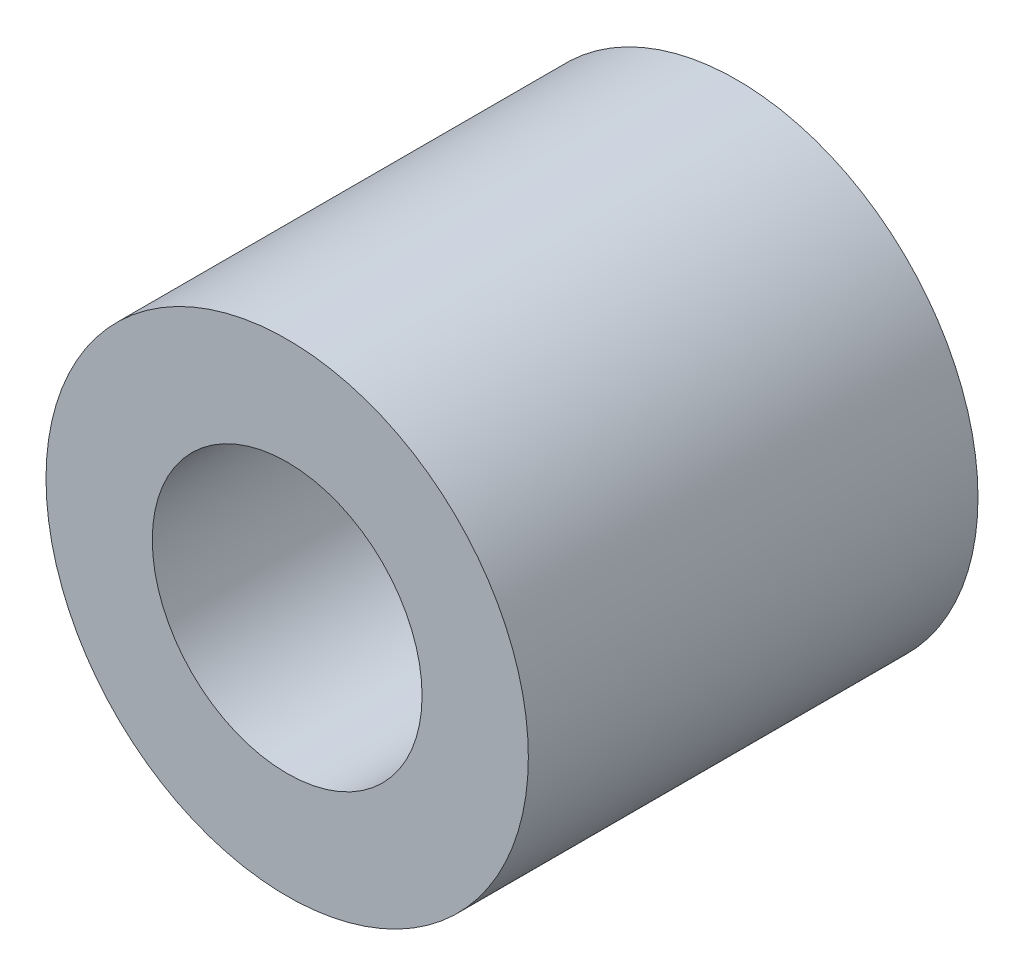
ISO-10303-21;
HEADER;
FILE_DESCRIPTION(('STEP AP214'),'2;1');
FILE_NAME('part.step','',(''),(''),'','','');
FILE_SCHEMA(('AUTOMOTIVE_DESIGN { 1 0 10303 214 1 1 1 1 }'));
ENDSEC;
DATA;
#1=APPLICATION_CONTEXT('core data for automotive mechanical design processes');
#2=APPLICATION_PROTOCOL_DEFINITION('international standard','automotive_design',2000,#1);
#3=PRODUCT_CONTEXT('',#1,'mechanical');
#4=PRODUCT('Part','Part','',(#3));
#5=PRODUCT_RELATED_PRODUCT_CATEGORY('part','',(#4));
#6=PRODUCT_DEFINITION_FORMATION('','',#4);
#7=PRODUCT_DEFINITION_CONTEXT('part definition',#1,'design');
#8=PRODUCT_DEFINITION('design','',#6,#7);
#9=PRODUCT_DEFINITION_SHAPE('','',#8);
#10=(LENGTH_UNIT() NAMED_UNIT(*) SI_UNIT(.MILLI.,.METRE.));
#11=(NAMED_UNIT(*) PLANE_ANGLE_UNIT() SI_UNIT($,.RADIAN.));
#12=(NAMED_UNIT(*) SI_UNIT($,.STERADIAN.) SOLID_ANGLE_UNIT());
#13=UNCERTAINTY_MEASURE_WITH_UNIT(LENGTH_MEASURE(1.E-05),#10,'distance_accuracy_value','');
#14=(GEOMETRIC_REPRESENTATION_CONTEXT(3) GLOBAL_UNCERTAINTY_ASSIGNED_CONTEXT((#13)) GLOBAL_UNIT_ASSIGNED_CONTEXT((#10,
#11,#12)) REPRESENTATION_CONTEXT('',''));
#15=CARTESIAN_POINT('',(0.,0.,0.));
#16=DIRECTION('',(0.,0.,1.));
#17=DIRECTION('',(1.,0.,0.));
#18=AXIS2_PLACEMENT_3D('',#15,#16,#17);
#19=CARTESIAN_POINT('',(0.,0.,5.5));
#20=DIRECTION('',(0.,0.,1.));
#21=DIRECTION('',(1.,0.,0.));
#22=AXIS2_PLACEMENT_3D('',#19,#20,#21);
#23=PLANE('',#22);
#24=CARTESIAN_POINT('',(0.,0.,5.5));
#25=DIRECTION('',(0.,0.,1.));
#26=DIRECTION('',(1.,0.,0.));
#27=AXIS2_PLACEMENT_3D('',#24,#25,#26);
#28=CIRCLE('',#27,2.95);
#29=CARTESIAN_POINT('',(2.95,0.,5.5));
#30=VERTEX_POINT('',#29);
#31=EDGE_CURVE('E10',#30,#30,#28,.T.);
#32=ORIENTED_EDGE('',*,*,#31,.T.);
#33=EDGE_LOOP('',(#32));
#34=FACE_BOUND('',#33,.T.);
#35=CARTESIAN_POINT('',(0.,0.,5.5));
#36=DIRECTION('',(0.,0.,1.));
#37=DIRECTION('',(1.,0.,0.));
#38=AXIS2_PLACEMENT_3D('',#35,#36,#37);
#39=CIRCLE('',#38,1.65);
#40=CARTESIAN_POINT('',(1.65,0.,5.5));
#41=VERTEX_POINT('',#40);
#42=EDGE_CURVE('E42',#41,#41,#39,.T.);
#43=ORIENTED_EDGE('',*,*,#42,.F.);
#44=EDGE_LOOP('',(#43));
#45=FACE_BOUND('',#44,.T.);
#46=ADVANCED_FACE('F31',(#34,#45),#23,.T.);
#47=CARTESIAN_POINT('',(0.,0.,0.));
#48=DIRECTION('',(0.,0.,1.));
#49=DIRECTION('',(1.,0.,0.));
#50=AXIS2_PLACEMENT_3D('',#47,#48,#49);
#51=PLANE('',#50);
#52=CARTESIAN_POINT('',(0.,0.,0.));
#53=DIRECTION('',(0.,0.,1.));
#54=DIRECTION('',(1.,0.,0.));
#55=AXIS2_PLACEMENT_3D('',#52,#53,#54);
#56=CIRCLE('',#55,2.95);
#57=CARTESIAN_POINT('',(2.95,0.,0.));
#58=VERTEX_POINT('',#57);
#59=EDGE_CURVE('E35',#58,#58,#56,.T.);
#60=ORIENTED_EDGE('',*,*,#59,.F.);
#61=EDGE_LOOP('',(#60));
#62=FACE_BOUND('',#61,.T.);
#63=CARTESIAN_POINT('',(0.,0.,0.));
#64=DIRECTION('',(0.,0.,1.));
#65=DIRECTION('',(1.,0.,0.));
#66=AXIS2_PLACEMENT_3D('',#63,#64,#65);
#67=CIRCLE('',#66,1.65);
#68=CARTESIAN_POINT('',(1.65,0.,0.));
#69=VERTEX_POINT('',#68);
#70=EDGE_CURVE('E44',#69,#69,#67,.T.);
#71=ORIENTED_EDGE('',*,*,#70,.T.);
#72=EDGE_LOOP('',(#71));
#73=FACE_BOUND('',#72,.T.);
#74=ADVANCED_FACE('F54',(#62,#73),#51,.F.);
#75=CARTESIAN_POINT('',(0.,0.,5.5));
#76=DIRECTION('',(0.,0.,-1.));
#77=DIRECTION('',(-1.,0.,0.));
#78=AXIS2_PLACEMENT_3D('',#75,#76,#77);
#79=CYLINDRICAL_SURFACE('',#78,2.95);
#80=ORIENTED_EDGE('',*,*,#31,.F.);
#81=EDGE_LOOP('',(#80));
#82=FACE_BOUND('',#81,.T.);
#83=ORIENTED_EDGE('',*,*,#59,.T.);
#84=EDGE_LOOP('',(#83));
#85=FACE_BOUND('',#84,.T.);
#86=ADVANCED_FACE('F33',(#82,#85),#79,.T.);
#87=CARTESIAN_POINT('',(0.,0.,5.5));
#88=DIRECTION('',(0.,0.,-1.));
#89=DIRECTION('',(-1.,0.,0.));
#90=AXIS2_PLACEMENT_3D('',#87,#88,#89);
#91=CYLINDRICAL_SURFACE('',#90,1.65);
#92=ORIENTED_EDGE('',*,*,#42,.T.);
#93=EDGE_LOOP('',(#92));
#94=FACE_BOUND('',#93,.T.);
#95=ORIENTED_EDGE('',*,*,#70,.F.);
#96=EDGE_LOOP('',(#95));
#97=FACE_BOUND('',#96,.T.);
#98=ADVANCED_FACE('F50',(#94,#97),#91,.F.);
#99=CLOSED_SHELL('',(#46,#74,#86,#98));
#100=MANIFOLD_SOLID_BREP('B2',#99);
#101=ADVANCED_BREP_SHAPE_REPRESENTATION('',(#18,#100),#14);
#102=SHAPE_DEFINITION_REPRESENTATION(#9,#101);
ENDSEC;
END-ISO-10303-21;
